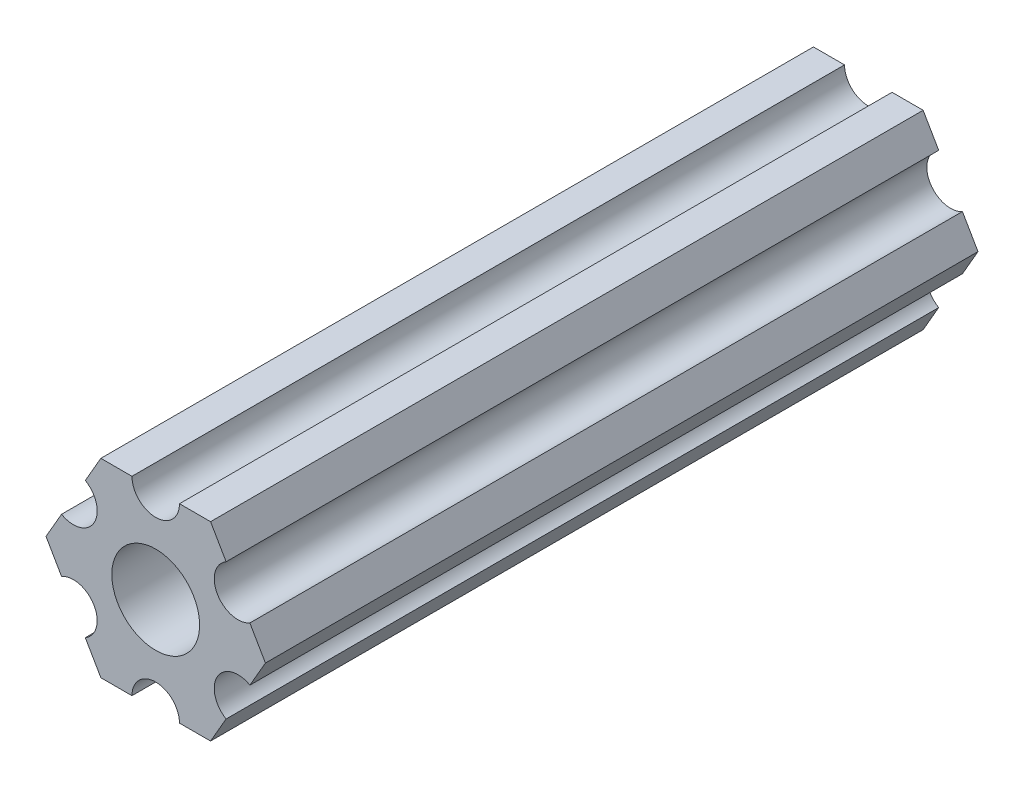
ISO-10303-21;
HEADER;
FILE_DESCRIPTION(('STEP AP214'),'2;1');
FILE_NAME('part.step','',(''),(''),'','','');
FILE_SCHEMA(('AUTOMOTIVE_DESIGN { 1 0 10303 214 1 1 1 1 }'));
ENDSEC;
DATA;
#1=APPLICATION_CONTEXT('core data for automotive mechanical design processes');
#2=APPLICATION_PROTOCOL_DEFINITION('international standard','automotive_design',2000,#1);
#3=PRODUCT_CONTEXT('',#1,'mechanical');
#4=PRODUCT('Part','Part','',(#3));
#5=PRODUCT_RELATED_PRODUCT_CATEGORY('part','',(#4));
#6=PRODUCT_DEFINITION_FORMATION('','',#4);
#7=PRODUCT_DEFINITION_CONTEXT('part definition',#1,'design');
#8=PRODUCT_DEFINITION('design','',#6,#7);
#9=PRODUCT_DEFINITION_SHAPE('','',#8);
#10=(LENGTH_UNIT() NAMED_UNIT(*) SI_UNIT(.MILLI.,.METRE.));
#11=(NAMED_UNIT(*) PLANE_ANGLE_UNIT() SI_UNIT($,.RADIAN.));
#12=(NAMED_UNIT(*) SI_UNIT($,.STERADIAN.) SOLID_ANGLE_UNIT());
#13=UNCERTAINTY_MEASURE_WITH_UNIT(LENGTH_MEASURE(1.E-05),#10,'distance_accuracy_value','');
#14=(GEOMETRIC_REPRESENTATION_CONTEXT(3) GLOBAL_UNCERTAINTY_ASSIGNED_CONTEXT((#13)) GLOBAL_UNIT_ASSIGNED_CONTEXT((#10,
#11,#12)) REPRESENTATION_CONTEXT('',''));
#15=CARTESIAN_POINT('',(0.,0.,0.));
#16=DIRECTION('',(0.,0.,1.));
#17=DIRECTION('',(1.,0.,0.));
#18=AXIS2_PLACEMENT_3D('',#15,#16,#17);
#19=CARTESIAN_POINT('',(5.49926169873049,-3.17500022210629,257.175));
#20=DIRECTION('',(0.,0.,1.));
#21=DIRECTION('',(1.,0.,0.));
#22=AXIS2_PLACEMENT_3D('',#19,#20,#21);
#23=CYLINDRICAL_SURFACE('',#22,1.5875);
#24=CARTESIAN_POINT('',(5.49926169873049,-3.17500022210629,304.8));
#25=DIRECTION('',(0.,0.,-1.));
#26=DIRECTION('',(-1.,0.,0.));
#27=AXIS2_PLACEMENT_3D('',#24,#25,#26);
#28=CIRCLE('',#27,1.5875);
#29=CARTESIAN_POINT('',(4.7055116987305,-4.5498155506141,304.8));
#30=VERTEX_POINT('',#29);
#31=CARTESIAN_POINT('',(6.29301169873047,-1.80018489359848,304.8));
#32=VERTEX_POINT('',#31);
#33=EDGE_CURVE('E190',#30,#32,#28,.T.);
#34=ORIENTED_EDGE('',*,*,#33,.F.);
#35=DIRECTION('',(0.,0.,1.));
#36=VECTOR('',#35,1.);
#37=CARTESIAN_POINT('',(4.7055116987305,-4.5498155506141,257.175));
#38=LINE('',#37,#36);
#39=CARTESIAN_POINT('',(4.7055116987305,-4.5498155506141,257.175));
#40=VERTEX_POINT('',#39);
#41=EDGE_CURVE('E11',#40,#30,#38,.T.);
#42=ORIENTED_EDGE('',*,*,#41,.F.);
#43=CARTESIAN_POINT('',(5.49926169873049,-3.17500022210629,257.175));
#44=DIRECTION('',(0.,0.,-1.));
#45=DIRECTION('',(-1.,0.,0.));
#46=AXIS2_PLACEMENT_3D('',#43,#44,#45);
#47=CIRCLE('',#46,1.5875);
#48=CARTESIAN_POINT('',(6.29301169873047,-1.80018489359848,257.175));
#49=VERTEX_POINT('',#48);
#50=EDGE_CURVE('E241',#40,#49,#47,.T.);
#51=ORIENTED_EDGE('',*,*,#50,.T.);
#52=DIRECTION('',(0.,0.,1.));
#53=VECTOR('',#52,1.);
#54=CARTESIAN_POINT('',(6.29301169873047,-1.80018489359848,257.175));
#55=LINE('',#54,#53);
#56=EDGE_CURVE('E36',#49,#32,#55,.T.);
#57=ORIENTED_EDGE('',*,*,#56,.T.);
#58=EDGE_LOOP('',(#34,#42,#51,#57));
#59=FACE_BOUND('',#58,.T.);
#60=ADVANCED_FACE('F33',(#59),#23,.F.);
#61=CARTESIAN_POINT('',(3.6661745940535,-6.35000022210627,257.175));
#62=DIRECTION('',(0.866025403784446,-0.499999999999988,0.));
#63=DIRECTION('',(0.499999999999988,0.866025403784446,0.));
#64=AXIS2_PLACEMENT_3D('',#61,#62,#63);
#65=PLANE('',#64);
#66=DIRECTION('',(0.499999999999988,0.866025403784446,0.));
#67=VECTOR('',#66,1.);
#68=CARTESIAN_POINT('',(3.6661745940535,-6.35000022210627,304.8));
#69=LINE('',#68,#67);
#70=CARTESIAN_POINT('',(3.6661745940535,-6.35000022210627,304.8));
#71=VERTEX_POINT('',#70);
#72=EDGE_CURVE('E239',#71,#30,#69,.T.);
#73=ORIENTED_EDGE('',*,*,#72,.F.);
#74=DIRECTION('',(0.,0.,1.));
#75=VECTOR('',#74,1.);
#76=CARTESIAN_POINT('',(3.6661745940535,-6.35000022210627,257.175));
#77=LINE('',#76,#75);
#78=CARTESIAN_POINT('',(3.6661745940535,-6.35000022210627,257.175));
#79=VERTEX_POINT('',#78);
#80=EDGE_CURVE('E42',#79,#71,#77,.T.);
#81=ORIENTED_EDGE('',*,*,#80,.F.);
#82=DIRECTION('',(0.499999999999988,0.866025403784446,0.));
#83=VECTOR('',#82,1.);
#84=CARTESIAN_POINT('',(3.6661745940535,-6.35000022210627,257.175));
#85=LINE('',#84,#83);
#86=EDGE_CURVE('E180',#79,#40,#85,.T.);
#87=ORIENTED_EDGE('',*,*,#86,.T.);
#88=ORIENTED_EDGE('',*,*,#41,.T.);
#89=EDGE_LOOP('',(#73,#81,#87,#88));
#90=FACE_BOUND('',#89,.T.);
#91=ADVANCED_FACE('F273',(#90),#65,.T.);
#92=CARTESIAN_POINT('',(1.58750038469929,-6.35000022210627,257.175));
#93=DIRECTION('',(0.,-1.,0.));
#94=DIRECTION('',(0.,0.,-1.));
#95=AXIS2_PLACEMENT_3D('',#92,#93,#94);
#96=PLANE('',#95);
#97=DIRECTION('',(1.,0.,0.));
#98=VECTOR('',#97,1.);
#99=CARTESIAN_POINT('',(1.58750038469929,-6.35000022210627,304.8));
#100=LINE('',#99,#98);
#101=CARTESIAN_POINT('',(1.58750038469929,-6.35000022210627,304.8));
#102=VERTEX_POINT('',#101);
#103=EDGE_CURVE('E167',#102,#71,#100,.T.);
#104=ORIENTED_EDGE('',*,*,#103,.F.);
#105=DIRECTION('',(0.,0.,1.));
#106=VECTOR('',#105,1.);
#107=CARTESIAN_POINT('',(1.58750038469929,-6.35000022210627,257.175));
#108=LINE('',#107,#106);
#109=CARTESIAN_POINT('',(1.58750038469929,-6.35000022210627,257.175));
#110=VERTEX_POINT('',#109);
#111=EDGE_CURVE('E162',#110,#102,#108,.T.);
#112=ORIENTED_EDGE('',*,*,#111,.F.);
#113=DIRECTION('',(1.,0.,0.));
#114=VECTOR('',#113,1.);
#115=CARTESIAN_POINT('',(1.58750038469929,-6.35000022210627,257.175));
#116=LINE('',#115,#114);
#117=EDGE_CURVE('E165',#110,#79,#116,.T.);
#118=ORIENTED_EDGE('',*,*,#117,.T.);
#119=ORIENTED_EDGE('',*,*,#80,.T.);
#120=EDGE_LOOP('',(#104,#112,#118,#119));
#121=FACE_BOUND('',#120,.T.);
#122=ADVANCED_FACE('F164',(#121),#96,.T.);
#123=CARTESIAN_POINT('',(3.84699290671026E-07,-6.35000022210627,257.175));
#124=DIRECTION('',(0.,0.,1.));
#125=DIRECTION('',(1.,0.,0.));
#126=AXIS2_PLACEMENT_3D('',#123,#124,#125);
#127=CYLINDRICAL_SURFACE('',#126,1.5875);
#128=CARTESIAN_POINT('',(3.84699290671026E-07,-6.35000022210627,304.8));
#129=DIRECTION('',(0.,0.,-1.));
#130=DIRECTION('',(-1.,0.,0.));
#131=AXIS2_PLACEMENT_3D('',#128,#129,#130);
#132=CIRCLE('',#131,1.5875);
#133=CARTESIAN_POINT('',(-1.58749961530071,-6.35000022210627,304.8));
#134=VERTEX_POINT('',#133);
#135=EDGE_CURVE('E236',#134,#102,#132,.T.);
#136=ORIENTED_EDGE('',*,*,#135,.F.);
#137=DIRECTION('',(0.,0.,1.));
#138=VECTOR('',#137,1.);
#139=CARTESIAN_POINT('',(-1.58749961530071,-6.35000022210627,257.175));
#140=LINE('',#139,#138);
#141=CARTESIAN_POINT('',(-1.58749961530071,-6.35000022210627,257.175));
#142=VERTEX_POINT('',#141);
#143=EDGE_CURVE('E172',#142,#134,#140,.T.);
#144=ORIENTED_EDGE('',*,*,#143,.F.);
#145=CARTESIAN_POINT('',(3.84699290671026E-07,-6.35000022210627,257.175));
#146=DIRECTION('',(0.,0.,-1.));
#147=DIRECTION('',(-1.,0.,0.));
#148=AXIS2_PLACEMENT_3D('',#145,#146,#147);
#149=CIRCLE('',#148,1.5875);
#150=EDGE_CURVE('E178',#142,#110,#149,.T.);
#151=ORIENTED_EDGE('',*,*,#150,.T.);
#152=ORIENTED_EDGE('',*,*,#111,.T.);
#153=EDGE_LOOP('',(#136,#144,#151,#152));
#154=FACE_BOUND('',#153,.T.);
#155=ADVANCED_FACE('F182',(#154),#127,.F.);
#156=CARTESIAN_POINT('',(-3.66617382465478,-6.35000022210627,257.175));
#157=DIRECTION('',(0.,-1.,0.));
#158=DIRECTION('',(1.,0.,0.));
#159=AXIS2_PLACEMENT_3D('',#156,#157,#158);
#160=PLANE('',#159);
#161=DIRECTION('',(1.,0.,0.));
#162=VECTOR('',#161,1.);
#163=CARTESIAN_POINT('',(-3.66617382465478,-6.35000022210627,304.8));
#164=LINE('',#163,#162);
#165=CARTESIAN_POINT('',(-3.66617382465478,-6.35000022210627,304.8));
#166=VERTEX_POINT('',#165);
#167=EDGE_CURVE('E233',#166,#134,#164,.T.);
#168=ORIENTED_EDGE('',*,*,#167,.F.);
#169=DIRECTION('',(0.,0.,1.));
#170=VECTOR('',#169,1.);
#171=CARTESIAN_POINT('',(-3.66617382465478,-6.35000022210627,257.175));
#172=LINE('',#171,#170);
#173=CARTESIAN_POINT('',(-3.66617382465478,-6.35000022210627,257.175));
#174=VERTEX_POINT('',#173);
#175=EDGE_CURVE('E245',#174,#166,#172,.T.);
#176=ORIENTED_EDGE('',*,*,#175,.F.);
#177=DIRECTION('',(1.,0.,0.));
#178=VECTOR('',#177,1.);
#179=CARTESIAN_POINT('',(-3.66617382465478,-6.35000022210627,257.175));
#180=LINE('',#179,#178);
#181=EDGE_CURVE('E183',#174,#142,#180,.T.);
#182=ORIENTED_EDGE('',*,*,#181,.T.);
#183=ORIENTED_EDGE('',*,*,#143,.T.);
#184=EDGE_LOOP('',(#168,#176,#182,#183));
#185=FACE_BOUND('',#184,.T.);
#186=ADVANCED_FACE('F286',(#185),#160,.T.);
#187=CARTESIAN_POINT('',(-4.70551103839171,-4.54981561357971,257.175));
#188=DIRECTION('',(-0.866025373493149,-0.500000052466048,0.));
#189=DIRECTION('',(0.500000052466048,-0.866025373493149,0.));
#190=AXIS2_PLACEMENT_3D('',#187,#188,#189);
#191=PLANE('',#190);
#192=DIRECTION('',(0.500000052466048,-0.866025373493149,0.));
#193=VECTOR('',#192,1.);
#194=CARTESIAN_POINT('',(-4.70551103839171,-4.54981561357971,304.8));
#195=LINE('',#194,#193);
#196=CARTESIAN_POINT('',(-4.70551103839171,-4.54981561357971,304.8));
#197=VERTEX_POINT('',#196);
#198=EDGE_CURVE('E230',#197,#166,#195,.T.);
#199=ORIENTED_EDGE('',*,*,#198,.F.);
#200=DIRECTION('',(0.,0.,1.));
#201=VECTOR('',#200,1.);
#202=CARTESIAN_POINT('',(-4.70551103839171,-4.54981561357971,257.175));
#203=LINE('',#202,#201);
#204=CARTESIAN_POINT('',(-4.70551103839171,-4.54981561357971,257.175));
#205=VERTEX_POINT('',#204);
#206=EDGE_CURVE('E247',#205,#197,#203,.T.);
#207=ORIENTED_EDGE('',*,*,#206,.F.);
#208=DIRECTION('',(0.500000052466048,-0.866025373493149,0.));
#209=VECTOR('',#208,1.);
#210=CARTESIAN_POINT('',(-4.70551103839171,-4.54981561357971,257.175));
#211=LINE('',#210,#209);
#212=EDGE_CURVE('E185',#205,#174,#211,.T.);
#213=ORIENTED_EDGE('',*,*,#212,.T.);
#214=ORIENTED_EDGE('',*,*,#175,.T.);
#215=EDGE_LOOP('',(#199,#207,#213,#214));
#216=FACE_BOUND('',#215,.T.);
#217=ADVANCED_FACE('F289',(#216),#191,.T.);
#218=CARTESIAN_POINT('',(-5.49926112168156,-3.17500033315934,257.175));
#219=DIRECTION('',(0.,0.,1.));
#220=DIRECTION('',(1.,0.,0.));
#221=AXIS2_PLACEMENT_3D('',#218,#219,#220);
#222=CYLINDRICAL_SURFACE('',#221,1.5875);
#223=CARTESIAN_POINT('',(-5.49926112168156,-3.17500033315934,304.8));
#224=DIRECTION('',(0.,0.,-1.));
#225=DIRECTION('',(-1.,0.,0.));
#226=AXIS2_PLACEMENT_3D('',#223,#224,#225);
#227=CIRCLE('',#226,1.5875);
#228=CARTESIAN_POINT('',(-6.29301120497141,-1.80018505273897,304.8));
#229=VERTEX_POINT('',#228);
#230=EDGE_CURVE('E227',#229,#197,#227,.T.);
#231=ORIENTED_EDGE('',*,*,#230,.F.);
#232=DIRECTION('',(0.,0.,1.));
#233=VECTOR('',#232,1.);
#234=CARTESIAN_POINT('',(-6.29301120497141,-1.80018505273897,257.175));
#235=LINE('',#234,#233);
#236=CARTESIAN_POINT('',(-6.29301120497141,-1.80018505273897,257.175));
#237=VERTEX_POINT('',#236);
#238=EDGE_CURVE('E249',#237,#229,#235,.T.);
#239=ORIENTED_EDGE('',*,*,#238,.F.);
#240=CARTESIAN_POINT('',(-5.49926112168156,-3.17500033315934,257.175));
#241=DIRECTION('',(0.,0.,-1.));
#242=DIRECTION('',(-1.,0.,0.));
#243=AXIS2_PLACEMENT_3D('',#240,#241,#242);
#244=CIRCLE('',#243,1.5875);
#245=EDGE_CURVE('E394',#237,#205,#244,.T.);
#246=ORIENTED_EDGE('',*,*,#245,.T.);
#247=ORIENTED_EDGE('',*,*,#206,.T.);
#248=EDGE_LOOP('',(#231,#239,#246,#247));
#249=FACE_BOUND('',#248,.T.);
#250=ADVANCED_FACE('F293',(#249),#222,.F.);
#251=CARTESIAN_POINT('',(-7.33234841870827,-4.44212523790841E-07,257.175));
#252=DIRECTION('',(-0.866025373493149,-0.500000052466048,0.));
#253=DIRECTION('',(0.500000052466048,-0.866025373493149,0.));
#254=AXIS2_PLACEMENT_3D('',#251,#252,#253);
#255=PLANE('',#254);
#256=DIRECTION('',(0.500000052466048,-0.86602537349315,0.));
#257=VECTOR('',#256,1.);
#258=CARTESIAN_POINT('',(-7.33234841870827,-4.44212523790841E-07,304.8));
#259=LINE('',#258,#257);
#260=CARTESIAN_POINT('',(-7.33234841870827,-4.44212523790841E-07,304.8));
#261=VERTEX_POINT('',#260);
#262=EDGE_CURVE('E224',#261,#229,#259,.T.);
#263=ORIENTED_EDGE('',*,*,#262,.F.);
#264=DIRECTION('',(0.,0.,1.));
#265=VECTOR('',#264,1.);
#266=CARTESIAN_POINT('',(-7.33234841870827,-4.44212523790841E-07,257.175));
#267=LINE('',#266,#265);
#268=CARTESIAN_POINT('',(-7.33234841870827,-4.44212523790841E-07,257.175));
#269=VERTEX_POINT('',#268);
#270=EDGE_CURVE('E251',#269,#261,#267,.T.);
#271=ORIENTED_EDGE('',*,*,#270,.F.);
#272=DIRECTION('',(0.500000052466048,-0.86602537349315,0.));
#273=VECTOR('',#272,1.);
#274=CARTESIAN_POINT('',(-7.33234841870827,-4.44212523790841E-07,257.175));
#275=LINE('',#274,#273);
#276=EDGE_CURVE('E391',#269,#237,#275,.T.);
#277=ORIENTED_EDGE('',*,*,#276,.T.);
#278=ORIENTED_EDGE('',*,*,#238,.T.);
#279=EDGE_LOOP('',(#263,#271,#277,#278));
#280=FACE_BOUND('',#279,.T.);
#281=ADVANCED_FACE('F297',(#280),#255,.T.);
#282=CARTESIAN_POINT('',(-6.29301142309098,1.80018429024547,257.175));
#283=DIRECTION('',(-0.866025434075722,0.499999947533955,0.));
#284=DIRECTION('',(-0.499999947533955,-0.866025434075722,0.));
#285=AXIS2_PLACEMENT_3D('',#282,#283,#284);
#286=PLANE('',#285);
#287=DIRECTION('',(-0.499999947533955,-0.866025434075722,0.));
#288=VECTOR('',#287,1.);
#289=CARTESIAN_POINT('',(-6.29301142309098,1.80018429024547,304.8));
#290=LINE('',#289,#288);
#291=CARTESIAN_POINT('',(-6.29301142309098,1.80018429024546,304.8));
#292=VERTEX_POINT('',#291);
#293=EDGE_CURVE('E221',#292,#261,#290,.T.);
#294=ORIENTED_EDGE('',*,*,#293,.F.);
#295=DIRECTION('',(0.,0.,1.));
#296=VECTOR('',#295,1.);
#297=CARTESIAN_POINT('',(-6.29301142309098,1.80018429024546,257.175));
#298=LINE('',#297,#296);
#299=CARTESIAN_POINT('',(-6.29301142309098,1.80018429024546,257.175));
#300=VERTEX_POINT('',#299);
#301=EDGE_CURVE('E253',#300,#292,#298,.T.);
#302=ORIENTED_EDGE('',*,*,#301,.F.);
#303=DIRECTION('',(-0.499999947533955,-0.866025434075722,0.));
#304=VECTOR('',#303,1.);
#305=CARTESIAN_POINT('',(-6.29301142309098,1.80018429024547,257.175));
#306=LINE('',#305,#304);
#307=EDGE_CURVE('E388',#300,#269,#306,.T.);
#308=ORIENTED_EDGE('',*,*,#307,.T.);
#309=ORIENTED_EDGE('',*,*,#270,.T.);
#310=EDGE_LOOP('',(#294,#302,#308,#309));
#311=FACE_BOUND('',#310,.T.);
#312=ADVANCED_FACE('F301',(#311),#286,.T.);
#313=CARTESIAN_POINT('',(-5.49926150638083,3.17499966684067,257.175));
#314=DIRECTION('',(0.,0.,1.));
#315=DIRECTION('',(1.,0.,0.));
#316=AXIS2_PLACEMENT_3D('',#313,#314,#315);
#317=CYLINDRICAL_SURFACE('',#316,1.5875);
#318=CARTESIAN_POINT('',(-5.49926150638083,3.17499966684067,304.8));
#319=DIRECTION('',(0.,0.,-1.));
#320=DIRECTION('',(-1.,0.,0.));
#321=AXIS2_PLACEMENT_3D('',#318,#319,#320);
#322=CIRCLE('',#321,1.5875);
#323=CARTESIAN_POINT('',(-4.70551158967067,4.54981504343588,304.8));
#324=VERTEX_POINT('',#323);
#325=EDGE_CURVE('E218',#324,#292,#322,.T.);
#326=ORIENTED_EDGE('',*,*,#325,.F.);
#327=DIRECTION('',(0.,0.,1.));
#328=VECTOR('',#327,1.);
#329=CARTESIAN_POINT('',(-4.70551158967067,4.54981504343588,257.175));
#330=LINE('',#329,#328);
#331=CARTESIAN_POINT('',(-4.70551158967067,4.54981504343588,257.175));
#332=VERTEX_POINT('',#331);
#333=EDGE_CURVE('E255',#332,#324,#330,.T.);
#334=ORIENTED_EDGE('',*,*,#333,.F.);
#335=CARTESIAN_POINT('',(-5.49926150638083,3.17499966684067,257.175));
#336=DIRECTION('',(0.,0.,-1.));
#337=DIRECTION('',(-1.,0.,0.));
#338=AXIS2_PLACEMENT_3D('',#335,#336,#337);
#339=CIRCLE('',#338,1.5875);
#340=EDGE_CURVE('E385',#332,#300,#339,.T.);
#341=ORIENTED_EDGE('',*,*,#340,.T.);
#342=ORIENTED_EDGE('',*,*,#301,.T.);
#343=EDGE_LOOP('',(#326,#334,#341,#342));
#344=FACE_BOUND('',#343,.T.);
#345=ADVANCED_FACE('F305',(#344),#317,.F.);
#346=CARTESIAN_POINT('',(-3.66617459405348,6.3499997778937,257.175));
#347=DIRECTION('',(-0.866025434075722,0.499999947533955,0.));
#348=DIRECTION('',(-0.499999947533955,-0.866025434075722,0.));
#349=AXIS2_PLACEMENT_3D('',#346,#347,#348);
#350=PLANE('',#349);
#351=DIRECTION('',(-0.499999947533955,-0.866025434075722,0.));
#352=VECTOR('',#351,1.);
#353=CARTESIAN_POINT('',(-3.66617459405348,6.3499997778937,304.8));
#354=LINE('',#353,#352);
#355=CARTESIAN_POINT('',(-3.66617459405348,6.3499997778937,304.8));
#356=VERTEX_POINT('',#355);
#357=EDGE_CURVE('E215',#356,#324,#354,.T.);
#358=ORIENTED_EDGE('',*,*,#357,.F.);
#359=DIRECTION('',(0.,0.,1.));
#360=VECTOR('',#359,1.);
#361=CARTESIAN_POINT('',(-3.66617459405348,6.3499997778937,257.175));
#362=LINE('',#361,#360);
#363=CARTESIAN_POINT('',(-3.66617459405348,6.3499997778937,257.175));
#364=VERTEX_POINT('',#363);
#365=EDGE_CURVE('E257',#364,#356,#362,.T.);
#366=ORIENTED_EDGE('',*,*,#365,.F.);
#367=DIRECTION('',(-0.499999947533955,-0.866025434075722,0.));
#368=VECTOR('',#367,1.);
#369=CARTESIAN_POINT('',(-3.66617459405348,6.3499997778937,257.175));
#370=LINE('',#369,#368);
#371=EDGE_CURVE('E382',#364,#332,#370,.T.);
#372=ORIENTED_EDGE('',*,*,#371,.T.);
#373=ORIENTED_EDGE('',*,*,#333,.T.);
#374=EDGE_LOOP('',(#358,#366,#372,#373));
#375=FACE_BOUND('',#374,.T.);
#376=ADVANCED_FACE('F309',(#375),#350,.T.);
#377=CARTESIAN_POINT('',(-1.58750038469926,6.3499997778937,257.175));
#378=DIRECTION('',(0.,1.,0.));
#379=DIRECTION('',(0.,0.,1.));
#380=AXIS2_PLACEMENT_3D('',#377,#378,#379);
#381=PLANE('',#380);
#382=DIRECTION('',(-1.,0.,0.));
#383=VECTOR('',#382,1.);
#384=CARTESIAN_POINT('',(-1.58750038469926,6.3499997778937,304.8));
#385=LINE('',#384,#383);
#386=CARTESIAN_POINT('',(-1.58750038469926,6.3499997778937,304.8));
#387=VERTEX_POINT('',#386);
#388=EDGE_CURVE('E212',#387,#356,#385,.T.);
#389=ORIENTED_EDGE('',*,*,#388,.F.);
#390=DIRECTION('',(0.,0.,1.));
#391=VECTOR('',#390,1.);
#392=CARTESIAN_POINT('',(-1.58750038469926,6.3499997778937,257.175));
#393=LINE('',#392,#391);
#394=CARTESIAN_POINT('',(-1.58750038469926,6.3499997778937,257.175));
#395=VERTEX_POINT('',#394);
#396=EDGE_CURVE('E259',#395,#387,#393,.T.);
#397=ORIENTED_EDGE('',*,*,#396,.F.);
#398=DIRECTION('',(-1.,0.,0.));
#399=VECTOR('',#398,1.);
#400=CARTESIAN_POINT('',(-1.58750038469926,6.3499997778937,257.175));
#401=LINE('',#400,#399);
#402=EDGE_CURVE('E379',#395,#364,#401,.T.);
#403=ORIENTED_EDGE('',*,*,#402,.T.);
#404=ORIENTED_EDGE('',*,*,#365,.T.);
#405=EDGE_LOOP('',(#389,#397,#403,#404));
#406=FACE_BOUND('',#405,.T.);
#407=ADVANCED_FACE('F313',(#406),#381,.T.);
#408=CARTESIAN_POINT('',(-3.84699252021695E-07,6.3499997778937,257.175));
#409=DIRECTION('',(0.,0.,1.));
#410=DIRECTION('',(1.,0.,0.));
#411=AXIS2_PLACEMENT_3D('',#408,#409,#410);
#412=CYLINDRICAL_SURFACE('',#411,1.5875);
#413=CARTESIAN_POINT('',(-3.84699252021695E-07,6.3499997778937,304.8));
#414=DIRECTION('',(0.,0.,-1.));
#415=DIRECTION('',(-1.,0.,0.));
#416=AXIS2_PLACEMENT_3D('',#413,#414,#415);
#417=CIRCLE('',#416,1.5875);
#418=CARTESIAN_POINT('',(1.58749961530075,6.3499997778937,304.8));
#419=VERTEX_POINT('',#418);
#420=EDGE_CURVE('E209',#419,#387,#417,.T.);
#421=ORIENTED_EDGE('',*,*,#420,.F.);
#422=DIRECTION('',(0.,0.,1.));
#423=VECTOR('',#422,1.);
#424=CARTESIAN_POINT('',(1.58749961530075,6.3499997778937,257.175));
#425=LINE('',#424,#423);
#426=CARTESIAN_POINT('',(1.58749961530075,6.3499997778937,257.175));
#427=VERTEX_POINT('',#426);
#428=EDGE_CURVE('E261',#427,#419,#425,.T.);
#429=ORIENTED_EDGE('',*,*,#428,.F.);
#430=CARTESIAN_POINT('',(-3.84699252021695E-07,6.3499997778937,257.175));
#431=DIRECTION('',(0.,0.,-1.));
#432=DIRECTION('',(-1.,0.,0.));
#433=AXIS2_PLACEMENT_3D('',#430,#431,#432);
#434=CIRCLE('',#433,1.5875);
#435=EDGE_CURVE('E376',#427,#395,#434,.T.);
#436=ORIENTED_EDGE('',*,*,#435,.T.);
#437=ORIENTED_EDGE('',*,*,#396,.T.);
#438=EDGE_LOOP('',(#421,#429,#436,#437));
#439=FACE_BOUND('',#438,.T.);
#440=ADVANCED_FACE('F317',(#439),#412,.F.);
#441=CARTESIAN_POINT('',(3.66617382465482,6.3499997778937,257.175));
#442=DIRECTION('',(0.,1.,0.));
#443=DIRECTION('',(0.,0.,1.));
#444=AXIS2_PLACEMENT_3D('',#441,#442,#443);
#445=PLANE('',#444);
#446=DIRECTION('',(-1.,0.,0.));
#447=VECTOR('',#446,1.);
#448=CARTESIAN_POINT('',(3.66617382465482,6.3499997778937,304.8));
#449=LINE('',#448,#447);
#450=CARTESIAN_POINT('',(3.66617382465482,6.3499997778937,304.8));
#451=VERTEX_POINT('',#450);
#452=EDGE_CURVE('E206',#451,#419,#449,.T.);
#453=ORIENTED_EDGE('',*,*,#452,.F.);
#454=DIRECTION('',(0.,0.,1.));
#455=VECTOR('',#454,1.);
#456=CARTESIAN_POINT('',(3.66617382465482,6.3499997778937,257.175));
#457=LINE('',#456,#455);
#458=CARTESIAN_POINT('',(3.66617382465482,6.3499997778937,257.175));
#459=VERTEX_POINT('',#458);
#460=EDGE_CURVE('E263',#459,#451,#457,.T.);
#461=ORIENTED_EDGE('',*,*,#460,.F.);
#462=DIRECTION('',(-1.,0.,0.));
#463=VECTOR('',#462,1.);
#464=CARTESIAN_POINT('',(3.66617382465482,6.3499997778937,257.175));
#465=LINE('',#464,#463);
#466=EDGE_CURVE('E373',#459,#427,#465,.T.);
#467=ORIENTED_EDGE('',*,*,#466,.T.);
#468=ORIENTED_EDGE('',*,*,#428,.T.);
#469=EDGE_LOOP('',(#453,#461,#467,#468));
#470=FACE_BOUND('',#469,.T.);
#471=ADVANCED_FACE('F321',(#470),#445,.T.);
#472=CARTESIAN_POINT('',(4.70551118909645,4.54981503427037,257.175));
#473=DIRECTION('',(0.866025358347508,0.500000078699064,0.));
#474=DIRECTION('',(-0.500000078699064,0.866025358347508,0.));
#475=AXIS2_PLACEMENT_3D('',#472,#473,#474);
#476=PLANE('',#475);
#477=DIRECTION('',(-0.500000078699064,0.866025358347508,0.));
#478=VECTOR('',#477,1.);
#479=CARTESIAN_POINT('',(4.70551118909645,4.54981503427037,304.8));
#480=LINE('',#479,#478);
#481=CARTESIAN_POINT('',(4.70551118909645,4.54981503427037,304.8));
#482=VERTEX_POINT('',#481);
#483=EDGE_CURVE('E203',#482,#451,#480,.T.);
#484=ORIENTED_EDGE('',*,*,#483,.F.);
#485=DIRECTION('',(0.,0.,1.));
#486=VECTOR('',#485,1.);
#487=CARTESIAN_POINT('',(4.70551118909645,4.54981503427037,257.175));
#488=LINE('',#487,#486);
#489=CARTESIAN_POINT('',(4.70551118909645,4.54981503427037,257.175));
#490=VERTEX_POINT('',#489);
#491=EDGE_CURVE('E265',#490,#482,#488,.T.);
#492=ORIENTED_EDGE('',*,*,#491,.F.);
#493=DIRECTION('',(-0.500000078699064,0.866025358347508,0.));
#494=VECTOR('',#493,1.);
#495=CARTESIAN_POINT('',(4.70551118909645,4.54981503427037,257.175));
#496=LINE('',#495,#494);
#497=EDGE_CURVE('E370',#490,#459,#496,.T.);
#498=ORIENTED_EDGE('',*,*,#497,.T.);
#499=ORIENTED_EDGE('',*,*,#460,.T.);
#500=EDGE_LOOP('',(#484,#492,#498,#499));
#501=FACE_BOUND('',#500,.T.);
#502=ADVANCED_FACE('F325',(#501),#476,.T.);
#503=CARTESIAN_POINT('',(5.49926131403121,3.1749997778937,257.175));
#504=DIRECTION('',(0.,0.,1.));
#505=DIRECTION('',(1.,0.,0.));
#506=AXIS2_PLACEMENT_3D('',#503,#504,#505);
#507=CYLINDRICAL_SURFACE('',#506,1.5875);
#508=CARTESIAN_POINT('',(5.49926131403121,3.1749997778937,304.8));
#509=DIRECTION('',(0.,0.,-1.));
#510=DIRECTION('',(-1.,0.,0.));
#511=AXIS2_PLACEMENT_3D('',#508,#509,#510);
#512=CIRCLE('',#511,1.5875);
#513=CARTESIAN_POINT('',(6.29301143896598,1.80018452151703,304.8));
#514=VERTEX_POINT('',#513);
#515=EDGE_CURVE('E200',#514,#482,#512,.T.);
#516=ORIENTED_EDGE('',*,*,#515,.F.);
#517=DIRECTION('',(0.,0.,1.));
#518=VECTOR('',#517,1.);
#519=CARTESIAN_POINT('',(6.29301143896598,1.80018452151703,257.175));
#520=LINE('',#519,#518);
#521=CARTESIAN_POINT('',(6.29301143896598,1.80018452151703,257.175));
#522=VERTEX_POINT('',#521);
#523=EDGE_CURVE('E267',#522,#514,#520,.T.);
#524=ORIENTED_EDGE('',*,*,#523,.F.);
#525=CARTESIAN_POINT('',(5.49926131403121,3.1749997778937,257.175));
#526=DIRECTION('',(0.,0.,-1.));
#527=DIRECTION('',(-1.,0.,0.));
#528=AXIS2_PLACEMENT_3D('',#525,#526,#527);
#529=CIRCLE('',#528,1.5875);
#530=EDGE_CURVE('E367',#522,#490,#529,.T.);
#531=ORIENTED_EDGE('',*,*,#530,.T.);
#532=ORIENTED_EDGE('',*,*,#491,.T.);
#533=EDGE_LOOP('',(#516,#524,#531,#532));
#534=FACE_BOUND('',#533,.T.);
#535=ADVANCED_FACE('F329',(#534),#507,.F.);
#536=CARTESIAN_POINT('',(7.33234880340755,-2.22106190273918E-07,257.175));
#537=DIRECTION('',(0.866025358347509,0.500000078699063,0.));
#538=DIRECTION('',(-0.500000078699063,0.866025358347509,0.));
#539=AXIS2_PLACEMENT_3D('',#536,#537,#538);
#540=PLANE('',#539);
#541=DIRECTION('',(-0.500000078699063,0.866025358347509,0.));
#542=VECTOR('',#541,1.);
#543=CARTESIAN_POINT('',(7.33234880340755,-2.22106190273918E-07,304.8));
#544=LINE('',#543,#542);
#545=CARTESIAN_POINT('',(7.33234880340755,-2.22106190273918E-07,304.8));
#546=VERTEX_POINT('',#545);
#547=EDGE_CURVE('E197',#546,#514,#544,.T.);
#548=ORIENTED_EDGE('',*,*,#547,.F.);
#549=DIRECTION('',(0.,0.,1.));
#550=VECTOR('',#549,1.);
#551=CARTESIAN_POINT('',(7.33234880340755,-2.22106190273918E-07,257.175));
#552=LINE('',#551,#550);
#553=CARTESIAN_POINT('',(7.33234880340755,-2.22106190273918E-07,257.175));
#554=VERTEX_POINT('',#553);
#555=EDGE_CURVE('E268',#554,#546,#552,.T.);
#556=ORIENTED_EDGE('',*,*,#555,.F.);
#557=DIRECTION('',(-0.500000078699063,0.866025358347509,0.));
#558=VECTOR('',#557,1.);
#559=CARTESIAN_POINT('',(7.33234880340755,-2.22106190273918E-07,257.175));
#560=LINE('',#559,#558);
#561=EDGE_CURVE('E364',#554,#522,#560,.T.);
#562=ORIENTED_EDGE('',*,*,#561,.T.);
#563=ORIENTED_EDGE('',*,*,#523,.T.);
#564=EDGE_LOOP('',(#548,#556,#562,#563));
#565=FACE_BOUND('',#564,.T.);
#566=ADVANCED_FACE('F333',(#565),#540,.T.);
#567=CARTESIAN_POINT('',(6.29301169873047,-1.80018489359848,257.175));
#568=DIRECTION('',(0.866025403784446,-0.499999999999988,0.));
#569=DIRECTION('',(0.499999999999988,0.866025403784446,0.));
#570=AXIS2_PLACEMENT_3D('',#567,#568,#569);
#571=PLANE('',#570);
#572=DIRECTION('',(0.499999999999988,0.866025403784446,0.));
#573=VECTOR('',#572,1.);
#574=CARTESIAN_POINT('',(6.29301169873047,-1.80018489359848,304.8));
#575=LINE('',#574,#573);
#576=EDGE_CURVE('E193',#32,#546,#575,.T.);
#577=ORIENTED_EDGE('',*,*,#576,.F.);
#578=ORIENTED_EDGE('',*,*,#56,.F.);
#579=DIRECTION('',(0.499999999999988,0.866025403784446,0.));
#580=VECTOR('',#579,1.);
#581=CARTESIAN_POINT('',(6.29301169873047,-1.80018489359848,257.175));
#582=LINE('',#581,#580);
#583=EDGE_CURVE('E362',#49,#554,#582,.T.);
#584=ORIENTED_EDGE('',*,*,#583,.T.);
#585=ORIENTED_EDGE('',*,*,#555,.T.);
#586=EDGE_LOOP('',(#577,#578,#584,#585));
#587=FACE_BOUND('',#586,.T.);
#588=ADVANCED_FACE('F270',(#587),#571,.T.);
#589=CARTESIAN_POINT('',(5.49926169873049,-3.17500022210629,257.175));
#590=DIRECTION('',(0.,0.,-1.));
#591=DIRECTION('',(-1.,0.,0.));
#592=AXIS2_PLACEMENT_3D('',#589,#590,#591);
#593=PLANE('',#592);
#594=CARTESIAN_POINT('',(0.,0.,257.175));
#595=DIRECTION('',(0.,0.,1.));
#596=DIRECTION('',(-1.,0.,0.));
#597=AXIS2_PLACEMENT_3D('',#594,#595,#596);
#598=CIRCLE('',#597,2.9337);
#599=CARTESIAN_POINT('',(-2.9337,0.,257.175));
#600=VERTEX_POINT('',#599);
#601=EDGE_CURVE('E194',#600,#600,#598,.T.);
#602=ORIENTED_EDGE('',*,*,#601,.T.);
#603=EDGE_LOOP('',(#602));
#604=FACE_BOUND('',#603,.T.);
#605=ORIENTED_EDGE('',*,*,#50,.F.);
#606=ORIENTED_EDGE('',*,*,#86,.F.);
#607=ORIENTED_EDGE('',*,*,#117,.F.);
#608=ORIENTED_EDGE('',*,*,#150,.F.);
#609=ORIENTED_EDGE('',*,*,#181,.F.);
#610=ORIENTED_EDGE('',*,*,#212,.F.);
#611=ORIENTED_EDGE('',*,*,#245,.F.);
#612=ORIENTED_EDGE('',*,*,#276,.F.);
#613=ORIENTED_EDGE('',*,*,#307,.F.);
#614=ORIENTED_EDGE('',*,*,#340,.F.);
#615=ORIENTED_EDGE('',*,*,#371,.F.);
#616=ORIENTED_EDGE('',*,*,#402,.F.);
#617=ORIENTED_EDGE('',*,*,#435,.F.);
#618=ORIENTED_EDGE('',*,*,#466,.F.);
#619=ORIENTED_EDGE('',*,*,#497,.F.);
#620=ORIENTED_EDGE('',*,*,#530,.F.);
#621=ORIENTED_EDGE('',*,*,#561,.F.);
#622=ORIENTED_EDGE('',*,*,#583,.F.);
#623=EDGE_LOOP('',(#605,#606,#607,#608,#609,#610,#611,#612,#613,#614,#615,#616,#617,#618,#619,
#620,#621,#622));
#624=FACE_BOUND('',#623,.T.);
#625=ADVANCED_FACE('F176',(#604,#624),#593,.T.);
#626=CARTESIAN_POINT('',(5.49926169873049,-3.17500022210629,304.8));
#627=DIRECTION('',(0.,0.,-1.));
#628=DIRECTION('',(-1.,0.,0.));
#629=AXIS2_PLACEMENT_3D('',#626,#627,#628);
#630=PLANE('',#629);
#631=CARTESIAN_POINT('',(0.,0.,304.8));
#632=DIRECTION('',(0.,0.,1.));
#633=DIRECTION('',(-1.,0.,0.));
#634=AXIS2_PLACEMENT_3D('',#631,#632,#633);
#635=CIRCLE('',#634,2.9337);
#636=CARTESIAN_POINT('',(-2.9337,0.,304.8));
#637=VERTEX_POINT('',#636);
#638=EDGE_CURVE('E357',#637,#637,#635,.T.);
#639=ORIENTED_EDGE('',*,*,#638,.F.);
#640=EDGE_LOOP('',(#639));
#641=FACE_BOUND('',#640,.T.);
#642=ORIENTED_EDGE('',*,*,#33,.T.);
#643=ORIENTED_EDGE('',*,*,#576,.T.);
#644=ORIENTED_EDGE('',*,*,#547,.T.);
#645=ORIENTED_EDGE('',*,*,#515,.T.);
#646=ORIENTED_EDGE('',*,*,#483,.T.);
#647=ORIENTED_EDGE('',*,*,#452,.T.);
#648=ORIENTED_EDGE('',*,*,#420,.T.);
#649=ORIENTED_EDGE('',*,*,#388,.T.);
#650=ORIENTED_EDGE('',*,*,#357,.T.);
#651=ORIENTED_EDGE('',*,*,#325,.T.);
#652=ORIENTED_EDGE('',*,*,#293,.T.);
#653=ORIENTED_EDGE('',*,*,#262,.T.);
#654=ORIENTED_EDGE('',*,*,#230,.T.);
#655=ORIENTED_EDGE('',*,*,#198,.T.);
#656=ORIENTED_EDGE('',*,*,#167,.T.);
#657=ORIENTED_EDGE('',*,*,#135,.T.);
#658=ORIENTED_EDGE('',*,*,#103,.T.);
#659=ORIENTED_EDGE('',*,*,#72,.T.);
#660=EDGE_LOOP('',(#642,#643,#644,#645,#646,#647,#648,#649,#650,#651,#652,#653,#654,#655,#656,
#657,#658,#659));
#661=FACE_BOUND('',#660,.T.);
#662=ADVANCED_FACE('F272',(#641,#661),#630,.F.);
#663=CARTESIAN_POINT('',(0.,0.,257.175));
#664=DIRECTION('',(0.,0.,1.));
#665=DIRECTION('',(1.,0.,0.));
#666=AXIS2_PLACEMENT_3D('',#663,#664,#665);
#667=CYLINDRICAL_SURFACE('',#666,2.9337);
#668=ORIENTED_EDGE('',*,*,#601,.F.);
#669=EDGE_LOOP('',(#668));
#670=FACE_BOUND('',#669,.T.);
#671=ORIENTED_EDGE('',*,*,#638,.T.);
#672=EDGE_LOOP('',(#671));
#673=FACE_BOUND('',#672,.T.);
#674=ADVANCED_FACE('F345',(#670,#673),#667,.F.);
#675=CLOSED_SHELL('',(#60,#91,#122,#155,#186,#217,#250,#281,#312,#345,#376,#407,#440,#471,#502,
#535,#566,#588,#625,#662,#674));
#676=MANIFOLD_SOLID_BREP('B2',#675);
#677=ADVANCED_BREP_SHAPE_REPRESENTATION('',(#18,#676),#14);
#678=SHAPE_DEFINITION_REPRESENTATION(#9,#677);
ENDSEC;
END-ISO-10303-21;
